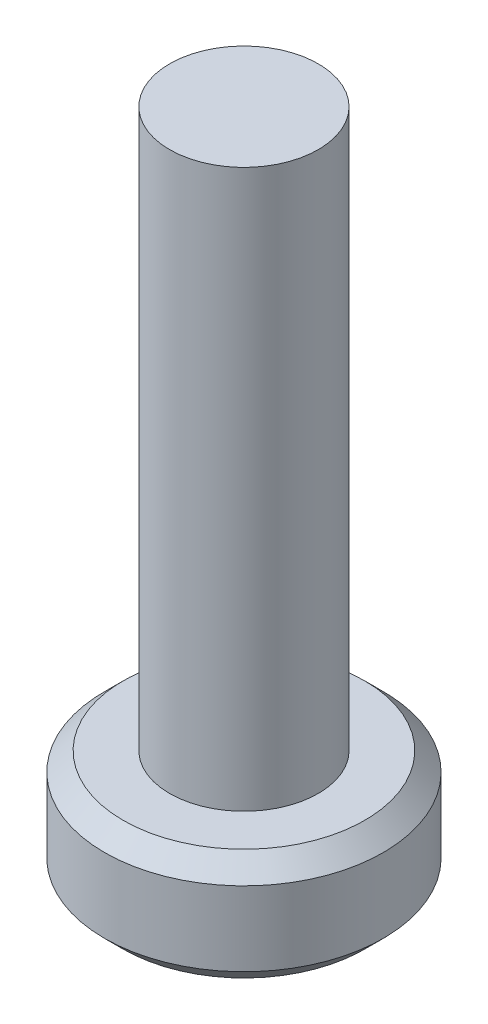
ISO-10303-21;
HEADER;
FILE_DESCRIPTION(('STEP AP214'),'2;1');
FILE_NAME('part.step','',(''),(''),'','','');
FILE_SCHEMA(('AUTOMOTIVE_DESIGN { 1 0 10303 214 1 1 1 1 }'));
ENDSEC;
DATA;
#1=APPLICATION_CONTEXT('core data for automotive mechanical design processes');
#2=APPLICATION_PROTOCOL_DEFINITION('international standard','automotive_design',2000,#1);
#3=PRODUCT_CONTEXT('',#1,'mechanical');
#4=PRODUCT('Part','Part','',(#3));
#5=PRODUCT_RELATED_PRODUCT_CATEGORY('part','',(#4));
#6=PRODUCT_DEFINITION_FORMATION('','',#4);
#7=PRODUCT_DEFINITION_CONTEXT('part definition',#1,'design');
#8=PRODUCT_DEFINITION('design','',#6,#7);
#9=PRODUCT_DEFINITION_SHAPE('','',#8);
#10=(LENGTH_UNIT() NAMED_UNIT(*) SI_UNIT(.MILLI.,.METRE.));
#11=(NAMED_UNIT(*) PLANE_ANGLE_UNIT() SI_UNIT($,.RADIAN.));
#12=(NAMED_UNIT(*) SI_UNIT($,.STERADIAN.) SOLID_ANGLE_UNIT());
#13=UNCERTAINTY_MEASURE_WITH_UNIT(LENGTH_MEASURE(1.E-05),#10,'distance_accuracy_value','');
#14=(GEOMETRIC_REPRESENTATION_CONTEXT(3) GLOBAL_UNCERTAINTY_ASSIGNED_CONTEXT((#13)) GLOBAL_UNIT_ASSIGNED_CONTEXT((#10,
#11,#12)) REPRESENTATION_CONTEXT('',''));
#15=CARTESIAN_POINT('',(0.,0.,0.));
#16=DIRECTION('',(0.,0.,1.));
#17=DIRECTION('',(1.,0.,0.));
#18=AXIS2_PLACEMENT_3D('',#15,#16,#17);
#19=CARTESIAN_POINT('',(0.,3.,0.));
#20=DIRECTION('',(0.,-1.,0.));
#21=DIRECTION('',(0.,0.,-1.));
#22=AXIS2_PLACEMENT_3D('',#19,#20,#21);
#23=CYLINDRICAL_SURFACE('',#22,3.75);
#24=CARTESIAN_POINT('',(0.,2.5,0.));
#25=DIRECTION('',(0.,1.,0.));
#26=DIRECTION('',(0.,0.,1.));
#27=AXIS2_PLACEMENT_3D('',#24,#25,#26);
#28=CIRCLE('',#27,3.75);
#29=CARTESIAN_POINT('',(0.,2.5,3.75));
#30=VERTEX_POINT('',#29);
#31=EDGE_CURVE('E53',#30,#30,#28,.F.);
#32=ORIENTED_EDGE('',*,*,#31,.T.);
#33=EDGE_LOOP('',(#32));
#34=FACE_BOUND('',#33,.T.);
#35=CARTESIAN_POINT('',(0.,0.499999999999996,0.));
#36=DIRECTION('',(0.,1.,0.));
#37=DIRECTION('',(0.,0.,1.));
#38=AXIS2_PLACEMENT_3D('',#35,#36,#37);
#39=CIRCLE('',#38,3.75);
#40=CARTESIAN_POINT('',(0.,0.499999999999996,3.75));
#41=VERTEX_POINT('',#40);
#42=EDGE_CURVE('E161',#41,#41,#39,.T.);
#43=ORIENTED_EDGE('',*,*,#42,.T.);
#44=EDGE_LOOP('',(#43));
#45=FACE_BOUND('',#44,.T.);
#46=ADVANCED_FACE('F44',(#34,#45),#23,.T.);
#47=CARTESIAN_POINT('',(0.,3.,0.));
#48=DIRECTION('',(0.,1.,0.));
#49=DIRECTION('',(0.,0.,1.));
#50=AXIS2_PLACEMENT_3D('',#47,#48,#49);
#51=PLANE('',#50);
#52=CARTESIAN_POINT('',(0.,3.,0.));
#53=DIRECTION('',(0.,1.,0.));
#54=DIRECTION('',(0.,0.,1.));
#55=AXIS2_PLACEMENT_3D('',#52,#53,#54);
#56=CIRCLE('',#55,3.25);
#57=CARTESIAN_POINT('',(0.,3.,3.25));
#58=VERTEX_POINT('',#57);
#59=EDGE_CURVE('E158',#58,#58,#56,.T.);
#60=ORIENTED_EDGE('',*,*,#59,.T.);
#61=EDGE_LOOP('',(#60));
#62=FACE_BOUND('',#61,.T.);
#63=CARTESIAN_POINT('',(0.,3.,0.));
#64=DIRECTION('',(0.,1.,0.));
#65=DIRECTION('',(0.,0.,1.));
#66=AXIS2_PLACEMENT_3D('',#63,#64,#65);
#67=CIRCLE('',#66,2.);
#68=CARTESIAN_POINT('',(0.,3.,2.));
#69=VERTEX_POINT('',#68);
#70=EDGE_CURVE('E155',#69,#69,#67,.T.);
#71=ORIENTED_EDGE('',*,*,#70,.F.);
#72=EDGE_LOOP('',(#71));
#73=FACE_BOUND('',#72,.T.);
#74=ADVANCED_FACE('F174',(#62,#73),#51,.T.);
#75=CARTESIAN_POINT('',(0.,0.,0.));
#76=DIRECTION('',(0.,1.,0.));
#77=DIRECTION('',(0.,0.,1.));
#78=AXIS2_PLACEMENT_3D('',#75,#76,#77);
#79=PLANE('',#78);
#80=DIRECTION('',(0.866025403784439,0.,0.5));
#81=VECTOR('',#80,1.);
#82=CARTESIAN_POINT('',(0.,0.,-2.88675134594813));
#83=LINE('',#82,#81);
#84=CARTESIAN_POINT('',(0.,0.,-2.88675134594813));
#85=VERTEX_POINT('',#84);
#86=CARTESIAN_POINT('',(2.5,0.,-1.44337567297406));
#87=VERTEX_POINT('',#86);
#88=EDGE_CURVE('E134',#85,#87,#83,.T.);
#89=ORIENTED_EDGE('',*,*,#88,.F.);
#90=DIRECTION('',(0.866025403784439,0.,-0.5));
#91=VECTOR('',#90,1.);
#92=CARTESIAN_POINT('',(-2.5,0.,-1.44337567297406));
#93=LINE('',#92,#91);
#94=CARTESIAN_POINT('',(-2.5,0.,-1.44337567297406));
#95=VERTEX_POINT('',#94);
#96=EDGE_CURVE('E60',#95,#85,#93,.T.);
#97=ORIENTED_EDGE('',*,*,#96,.F.);
#98=DIRECTION('',(0.,0.,-1.));
#99=VECTOR('',#98,1.);
#100=CARTESIAN_POINT('',(-2.5,0.,1.44337567297406));
#101=LINE('',#100,#99);
#102=CARTESIAN_POINT('',(-2.5,0.,1.44337567297406));
#103=VERTEX_POINT('',#102);
#104=EDGE_CURVE('E143',#103,#95,#101,.T.);
#105=ORIENTED_EDGE('',*,*,#104,.F.);
#106=DIRECTION('',(-0.866025403784439,0.,-0.5));
#107=VECTOR('',#106,1.);
#108=CARTESIAN_POINT('',(0.,0.,2.88675134594813));
#109=LINE('',#108,#107);
#110=CARTESIAN_POINT('',(0.,0.,2.88675134594813));
#111=VERTEX_POINT('',#110);
#112=EDGE_CURVE('E141',#111,#103,#109,.T.);
#113=ORIENTED_EDGE('',*,*,#112,.F.);
#114=DIRECTION('',(-0.866025403784439,0.,0.5));
#115=VECTOR('',#114,1.);
#116=CARTESIAN_POINT('',(2.5,0.,1.44337567297407));
#117=LINE('',#116,#115);
#118=CARTESIAN_POINT('',(2.5,0.,1.44337567297407));
#119=VERTEX_POINT('',#118);
#120=EDGE_CURVE('E108',#119,#111,#117,.T.);
#121=ORIENTED_EDGE('',*,*,#120,.F.);
#122=DIRECTION('',(0.,0.,1.));
#123=VECTOR('',#122,1.);
#124=CARTESIAN_POINT('',(2.5,0.,-1.44337567297406));
#125=LINE('',#124,#123);
#126=EDGE_CURVE('E137',#87,#119,#125,.T.);
#127=ORIENTED_EDGE('',*,*,#126,.F.);
#128=EDGE_LOOP('',(#89,#97,#105,#113,#121,#127));
#129=FACE_BOUND('',#128,.T.);
#130=CARTESIAN_POINT('',(0.,0.,0.));
#131=DIRECTION('',(0.,1.,0.));
#132=DIRECTION('',(0.,0.,1.));
#133=AXIS2_PLACEMENT_3D('',#130,#131,#132);
#134=CIRCLE('',#133,3.25);
#135=CARTESIAN_POINT('',(0.,0.,3.25));
#136=VERTEX_POINT('',#135);
#137=EDGE_CURVE('E11',#136,#136,#134,.F.);
#138=ORIENTED_EDGE('',*,*,#137,.T.);
#139=EDGE_LOOP('',(#138));
#140=FACE_BOUND('',#139,.T.);
#141=ADVANCED_FACE('F177',(#129,#140),#79,.F.);
#142=CARTESIAN_POINT('',(0.,18.,0.));
#143=DIRECTION('',(0.,-1.,0.));
#144=DIRECTION('',(0.,0.,-1.));
#145=AXIS2_PLACEMENT_3D('',#142,#143,#144);
#146=CYLINDRICAL_SURFACE('',#145,2.);
#147=CARTESIAN_POINT('',(0.,18.,0.));
#148=DIRECTION('',(0.,1.,0.));
#149=DIRECTION('',(0.,0.,1.));
#150=AXIS2_PLACEMENT_3D('',#147,#148,#149);
#151=CIRCLE('',#150,2.);
#152=CARTESIAN_POINT('',(0.,18.,2.));
#153=VERTEX_POINT('',#152);
#154=EDGE_CURVE('E147',#153,#153,#151,.T.);
#155=ORIENTED_EDGE('',*,*,#154,.F.);
#156=EDGE_LOOP('',(#155));
#157=FACE_BOUND('',#156,.T.);
#158=ORIENTED_EDGE('',*,*,#70,.T.);
#159=EDGE_LOOP('',(#158));
#160=FACE_BOUND('',#159,.T.);
#161=ADVANCED_FACE('F181',(#157,#160),#146,.T.);
#162=CARTESIAN_POINT('',(0.,18.,0.));
#163=DIRECTION('',(0.,1.,0.));
#164=DIRECTION('',(0.,0.,1.));
#165=AXIS2_PLACEMENT_3D('',#162,#163,#164);
#166=PLANE('',#165);
#167=ORIENTED_EDGE('',*,*,#154,.T.);
#168=EDGE_LOOP('',(#167));
#169=FACE_BOUND('',#168,.T.);
#170=ADVANCED_FACE('F171',(#169),#166,.T.);
#171=CARTESIAN_POINT('',(0.,3.,0.));
#172=DIRECTION('',(0.,-1.,0.));
#173=DIRECTION('',(0.,0.,-1.));
#174=AXIS2_PLACEMENT_3D('',#171,#172,#173);
#175=CONICAL_SURFACE('',#174,3.25,0.78539816339745);
#176=ORIENTED_EDGE('',*,*,#31,.F.);
#177=EDGE_LOOP('',(#176));
#178=FACE_BOUND('',#177,.T.);
#179=ORIENTED_EDGE('',*,*,#59,.F.);
#180=EDGE_LOOP('',(#179));
#181=FACE_BOUND('',#180,.T.);
#182=ADVANCED_FACE('F168',(#178,#181),#175,.T.);
#183=CARTESIAN_POINT('',(0.,0.499999999999996,0.));
#184=DIRECTION('',(0.,1.,0.));
#185=DIRECTION('',(0.,0.,1.));
#186=AXIS2_PLACEMENT_3D('',#183,#184,#185);
#187=CONICAL_SURFACE('',#186,3.75,0.785398163397451);
#188=ORIENTED_EDGE('',*,*,#137,.F.);
#189=EDGE_LOOP('',(#188));
#190=FACE_BOUND('',#189,.T.);
#191=ORIENTED_EDGE('',*,*,#42,.F.);
#192=EDGE_LOOP('',(#191));
#193=FACE_BOUND('',#192,.T.);
#194=ADVANCED_FACE('F47',(#190,#193),#187,.T.);
#195=CARTESIAN_POINT('',(-2.5,1.,-1.44337567297406));
#196=DIRECTION('',(-0.5,0.,-0.866025403784439));
#197=DIRECTION('',(-0.866025403784439,0.,0.5));
#198=AXIS2_PLACEMENT_3D('',#195,#196,#197);
#199=PLANE('',#198);
#200=ORIENTED_EDGE('',*,*,#96,.T.);
#201=DIRECTION('',(0.,-1.,0.));
#202=VECTOR('',#201,1.);
#203=CARTESIAN_POINT('',(0.,1.,-2.88675134594813));
#204=LINE('',#203,#202);
#205=CARTESIAN_POINT('',(0.,1.,-2.88675134594813));
#206=VERTEX_POINT('',#205);
#207=EDGE_CURVE('E90',#206,#85,#204,.T.);
#208=ORIENTED_EDGE('',*,*,#207,.F.);
#209=DIRECTION('',(0.866025403784439,0.,-0.5));
#210=VECTOR('',#209,1.);
#211=CARTESIAN_POINT('',(-2.5,1.,-1.44337567297406));
#212=LINE('',#211,#210);
#213=CARTESIAN_POINT('',(-2.5,1.,-1.44337567297406));
#214=VERTEX_POINT('',#213);
#215=EDGE_CURVE('E145',#214,#206,#212,.T.);
#216=ORIENTED_EDGE('',*,*,#215,.F.);
#217=DIRECTION('',(0.,-1.,0.));
#218=VECTOR('',#217,1.);
#219=CARTESIAN_POINT('',(-2.5,1.,-1.44337567297406));
#220=LINE('',#219,#218);
#221=EDGE_CURVE('E68',#214,#95,#220,.T.);
#222=ORIENTED_EDGE('',*,*,#221,.T.);
#223=EDGE_LOOP('',(#200,#208,#216,#222));
#224=FACE_BOUND('',#223,.T.);
#225=ADVANCED_FACE('F224',(#224),#199,.F.);
#226=CARTESIAN_POINT('',(-2.5,1.,1.44337567297406));
#227=DIRECTION('',(-1.,0.,0.));
#228=DIRECTION('',(0.,0.,1.));
#229=AXIS2_PLACEMENT_3D('',#226,#227,#228);
#230=PLANE('',#229);
#231=ORIENTED_EDGE('',*,*,#104,.T.);
#232=ORIENTED_EDGE('',*,*,#221,.F.);
#233=DIRECTION('',(0.,0.,-1.));
#234=VECTOR('',#233,1.);
#235=CARTESIAN_POINT('',(-2.5,1.,1.44337567297406));
#236=LINE('',#235,#234);
#237=CARTESIAN_POINT('',(-2.5,1.,1.44337567297406));
#238=VERTEX_POINT('',#237);
#239=EDGE_CURVE('E120',#238,#214,#236,.T.);
#240=ORIENTED_EDGE('',*,*,#239,.F.);
#241=DIRECTION('',(0.,-1.,0.));
#242=VECTOR('',#241,1.);
#243=CARTESIAN_POINT('',(-2.5,1.,1.44337567297406));
#244=LINE('',#243,#242);
#245=EDGE_CURVE('E112',#238,#103,#244,.T.);
#246=ORIENTED_EDGE('',*,*,#245,.T.);
#247=EDGE_LOOP('',(#231,#232,#240,#246));
#248=FACE_BOUND('',#247,.T.);
#249=ADVANCED_FACE('F229',(#248),#230,.F.);
#250=CARTESIAN_POINT('',(0.,1.,2.88675134594813));
#251=DIRECTION('',(-0.5,0.,0.866025403784439));
#252=DIRECTION('',(0.866025403784439,0.,0.5));
#253=AXIS2_PLACEMENT_3D('',#250,#251,#252);
#254=PLANE('',#253);
#255=ORIENTED_EDGE('',*,*,#112,.T.);
#256=ORIENTED_EDGE('',*,*,#245,.F.);
#257=DIRECTION('',(-0.866025403784439,0.,-0.5));
#258=VECTOR('',#257,1.);
#259=CARTESIAN_POINT('',(0.,1.,2.88675134594813));
#260=LINE('',#259,#258);
#261=CARTESIAN_POINT('',(0.,1.,2.88675134594813));
#262=VERTEX_POINT('',#261);
#263=EDGE_CURVE('E116',#262,#238,#260,.T.);
#264=ORIENTED_EDGE('',*,*,#263,.F.);
#265=DIRECTION('',(0.,-1.,0.));
#266=VECTOR('',#265,1.);
#267=CARTESIAN_POINT('',(0.,1.,2.88675134594813));
#268=LINE('',#267,#266);
#269=EDGE_CURVE('E101',#262,#111,#268,.T.);
#270=ORIENTED_EDGE('',*,*,#269,.T.);
#271=EDGE_LOOP('',(#255,#256,#264,#270));
#272=FACE_BOUND('',#271,.T.);
#273=ADVANCED_FACE('F117',(#272),#254,.F.);
#274=CARTESIAN_POINT('',(2.5,1.,1.44337567297407));
#275=DIRECTION('',(0.5,0.,0.866025403784439));
#276=DIRECTION('',(0.866025403784439,0.,-0.5));
#277=AXIS2_PLACEMENT_3D('',#274,#275,#276);
#278=PLANE('',#277);
#279=ORIENTED_EDGE('',*,*,#120,.T.);
#280=ORIENTED_EDGE('',*,*,#269,.F.);
#281=DIRECTION('',(-0.866025403784439,0.,0.5));
#282=VECTOR('',#281,1.);
#283=CARTESIAN_POINT('',(2.5,1.,1.44337567297407));
#284=LINE('',#283,#282);
#285=CARTESIAN_POINT('',(2.5,1.,1.44337567297407));
#286=VERTEX_POINT('',#285);
#287=EDGE_CURVE('E105',#286,#262,#284,.T.);
#288=ORIENTED_EDGE('',*,*,#287,.F.);
#289=DIRECTION('',(0.,-1.,0.));
#290=VECTOR('',#289,1.);
#291=CARTESIAN_POINT('',(2.5,1.,1.44337567297407));
#292=LINE('',#291,#290);
#293=EDGE_CURVE('E113',#286,#119,#292,.T.);
#294=ORIENTED_EDGE('',*,*,#293,.T.);
#295=EDGE_LOOP('',(#279,#280,#288,#294));
#296=FACE_BOUND('',#295,.T.);
#297=ADVANCED_FACE('F103',(#296),#278,.F.);
#298=CARTESIAN_POINT('',(2.5,1.,-1.44337567297406));
#299=DIRECTION('',(1.,0.,0.));
#300=DIRECTION('',(0.,0.,-1.));
#301=AXIS2_PLACEMENT_3D('',#298,#299,#300);
#302=PLANE('',#301);
#303=ORIENTED_EDGE('',*,*,#126,.T.);
#304=ORIENTED_EDGE('',*,*,#293,.F.);
#305=DIRECTION('',(0.,0.,1.));
#306=VECTOR('',#305,1.);
#307=CARTESIAN_POINT('',(2.5,1.,-1.44337567297406));
#308=LINE('',#307,#306);
#309=CARTESIAN_POINT('',(2.5,1.,-1.44337567297406));
#310=VERTEX_POINT('',#309);
#311=EDGE_CURVE('E126',#310,#286,#308,.T.);
#312=ORIENTED_EDGE('',*,*,#311,.F.);
#313=DIRECTION('',(0.,-1.,0.));
#314=VECTOR('',#313,1.);
#315=CARTESIAN_POINT('',(2.5,1.,-1.44337567297406));
#316=LINE('',#315,#314);
#317=EDGE_CURVE('E150',#310,#87,#316,.T.);
#318=ORIENTED_EDGE('',*,*,#317,.T.);
#319=EDGE_LOOP('',(#303,#304,#312,#318));
#320=FACE_BOUND('',#319,.T.);
#321=ADVANCED_FACE('F257',(#320),#302,.F.);
#322=CARTESIAN_POINT('',(0.,1.,-2.88675134594813));
#323=DIRECTION('',(0.5,0.,-0.866025403784439));
#324=DIRECTION('',(-0.866025403784439,0.,-0.5));
#325=AXIS2_PLACEMENT_3D('',#322,#323,#324);
#326=PLANE('',#325);
#327=ORIENTED_EDGE('',*,*,#88,.T.);
#328=ORIENTED_EDGE('',*,*,#317,.F.);
#329=DIRECTION('',(0.866025403784439,0.,0.5));
#330=VECTOR('',#329,1.);
#331=CARTESIAN_POINT('',(0.,1.,-2.88675134594813));
#332=LINE('',#331,#330);
#333=EDGE_CURVE('E128',#206,#310,#332,.T.);
#334=ORIENTED_EDGE('',*,*,#333,.F.);
#335=ORIENTED_EDGE('',*,*,#207,.T.);
#336=EDGE_LOOP('',(#327,#328,#334,#335));
#337=FACE_BOUND('',#336,.T.);
#338=ADVANCED_FACE('F267',(#337),#326,.F.);
#339=CARTESIAN_POINT('',(0.,1.,0.));
#340=DIRECTION('',(0.,-1.,0.));
#341=DIRECTION('',(0.,0.,-1.));
#342=AXIS2_PLACEMENT_3D('',#339,#340,#341);
#343=PLANE('',#342);
#344=ORIENTED_EDGE('',*,*,#215,.T.);
#345=ORIENTED_EDGE('',*,*,#333,.T.);
#346=ORIENTED_EDGE('',*,*,#311,.T.);
#347=ORIENTED_EDGE('',*,*,#287,.T.);
#348=ORIENTED_EDGE('',*,*,#263,.T.);
#349=ORIENTED_EDGE('',*,*,#239,.T.);
#350=EDGE_LOOP('',(#344,#345,#346,#347,#348,#349));
#351=FACE_BOUND('',#350,.T.);
#352=ADVANCED_FACE('F123',(#351),#343,.T.);
#353=CLOSED_SHELL('',(#46,#74,#141,#161,#170,#182,#194,#225,#249,#273,#297,#321,#338,#352));
#354=MANIFOLD_SOLID_BREP('B2',#353);
#355=ADVANCED_BREP_SHAPE_REPRESENTATION('',(#18,#354),#14);
#356=SHAPE_DEFINITION_REPRESENTATION(#9,#355);
ENDSEC;
END-ISO-10303-21;
